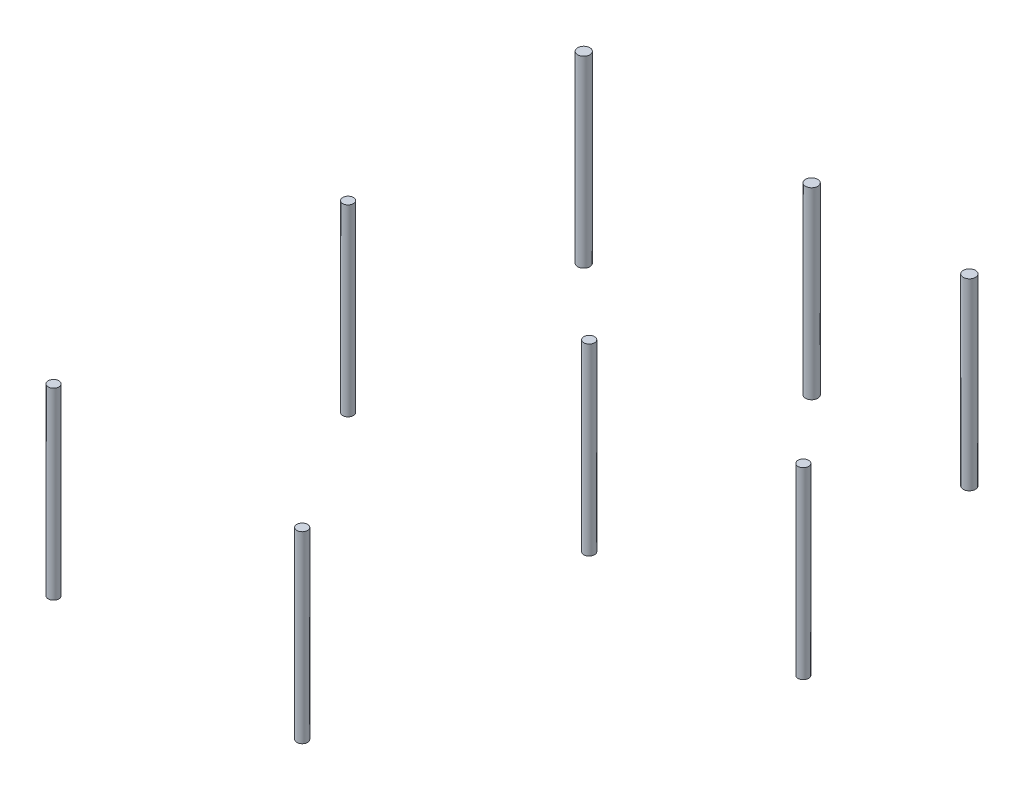
ISO-10303-21;
HEADER;
FILE_DESCRIPTION(('STEP AP214'),'2;1');
FILE_NAME('part.step','',(''),(''),'','','');
FILE_SCHEMA(('AUTOMOTIVE_DESIGN { 1 0 10303 214 1 1 1 1 }'));
ENDSEC;
DATA;
#1=APPLICATION_CONTEXT('core data for automotive mechanical design processes');
#2=APPLICATION_PROTOCOL_DEFINITION('international standard','automotive_design',2000,#1);
#3=PRODUCT_CONTEXT('',#1,'mechanical');
#4=PRODUCT('Part','Part','',(#3));
#5=PRODUCT_RELATED_PRODUCT_CATEGORY('part','',(#4));
#6=PRODUCT_DEFINITION_FORMATION('','',#4);
#7=PRODUCT_DEFINITION_CONTEXT('part definition',#1,'design');
#8=PRODUCT_DEFINITION('design','',#6,#7);
#9=PRODUCT_DEFINITION_SHAPE('','',#8);
#10=(LENGTH_UNIT() NAMED_UNIT(*) SI_UNIT(.MILLI.,.METRE.));
#11=(NAMED_UNIT(*) PLANE_ANGLE_UNIT() SI_UNIT($,.RADIAN.));
#12=(NAMED_UNIT(*) SI_UNIT($,.STERADIAN.) SOLID_ANGLE_UNIT());
#13=UNCERTAINTY_MEASURE_WITH_UNIT(LENGTH_MEASURE(1.E-05),#10,'distance_accuracy_value','');
#14=(GEOMETRIC_REPRESENTATION_CONTEXT(3) GLOBAL_UNCERTAINTY_ASSIGNED_CONTEXT((#13)) GLOBAL_UNIT_ASSIGNED_CONTEXT((#10,
#11,#12)) REPRESENTATION_CONTEXT('',''));
#15=CARTESIAN_POINT('',(0.,0.,0.));
#16=DIRECTION('',(0.,0.,1.));
#17=DIRECTION('',(1.,0.,0.));
#18=AXIS2_PLACEMENT_3D('',#15,#16,#17);
#19=CARTESIAN_POINT('',(325.,240.,0.));
#20=DIRECTION('',(0.,-1.,0.));
#21=DIRECTION('',(0.,0.,-1.));
#22=AXIS2_PLACEMENT_3D('',#19,#20,#21);
#23=CYLINDRICAL_SURFACE('',#22,6.99999999999999);
#24=CARTESIAN_POINT('',(325.,240.,0.));
#25=DIRECTION('',(0.,1.,0.));
#26=DIRECTION('',(0.,0.,1.));
#27=AXIS2_PLACEMENT_3D('',#24,#25,#26);
#28=CIRCLE('',#27,6.99999999999999);
#29=CARTESIAN_POINT('',(325.,240.,6.99999999999999));
#30=VERTEX_POINT('',#29);
#31=EDGE_CURVE('E11',#30,#30,#28,.T.);
#32=ORIENTED_EDGE('',*,*,#31,.F.);
#33=EDGE_LOOP('',(#32));
#34=FACE_BOUND('',#33,.T.);
#35=CARTESIAN_POINT('',(325.,0.,0.));
#36=DIRECTION('',(0.,1.,0.));
#37=DIRECTION('',(0.,0.,1.));
#38=AXIS2_PLACEMENT_3D('',#35,#36,#37);
#39=CIRCLE('',#38,6.99999999999999);
#40=CARTESIAN_POINT('',(325.,0.,6.99999999999999));
#41=VERTEX_POINT('',#40);
#42=EDGE_CURVE('E43',#41,#41,#39,.T.);
#43=ORIENTED_EDGE('',*,*,#42,.T.);
#44=EDGE_LOOP('',(#43));
#45=FACE_BOUND('',#44,.T.);
#46=ADVANCED_FACE('F40',(#34,#45),#23,.T.);
#47=CARTESIAN_POINT('',(325.,240.,0.));
#48=DIRECTION('',(0.,1.,0.));
#49=DIRECTION('',(0.,0.,1.));
#50=AXIS2_PLACEMENT_3D('',#47,#48,#49);
#51=PLANE('',#50);
#52=ORIENTED_EDGE('',*,*,#31,.T.);
#53=EDGE_LOOP('',(#52));
#54=FACE_BOUND('',#53,.T.);
#55=ADVANCED_FACE('F55',(#54),#51,.T.);
#56=CARTESIAN_POINT('',(325.,0.,0.));
#57=DIRECTION('',(0.,1.,0.));
#58=DIRECTION('',(0.,0.,1.));
#59=AXIS2_PLACEMENT_3D('',#56,#57,#58);
#60=PLANE('',#59);
#61=ORIENTED_EDGE('',*,*,#42,.F.);
#62=EDGE_LOOP('',(#61));
#63=FACE_BOUND('',#62,.T.);
#64=ADVANCED_FACE('F53',(#63),#60,.F.);
#65=CLOSED_SHELL('',(#46,#55,#64));
#66=MANIFOLD_SOLID_BREP('B2',#65);
#67=CARTESIAN_POINT('',(0.,240.,0.));
#68=DIRECTION('',(0.,-1.,0.));
#69=DIRECTION('',(0.,0.,-1.));
#70=AXIS2_PLACEMENT_3D('',#67,#68,#69);
#71=CYLINDRICAL_SURFACE('',#70,7.);
#72=CARTESIAN_POINT('',(0.,240.,0.));
#73=DIRECTION('',(0.,1.,0.));
#74=DIRECTION('',(0.,0.,1.));
#75=AXIS2_PLACEMENT_3D('',#72,#73,#74);
#76=CIRCLE('',#75,7.);
#77=CARTESIAN_POINT('',(0.,240.,7.));
#78=VERTEX_POINT('',#77);
#79=EDGE_CURVE('E39',#78,#78,#76,.T.);
#80=ORIENTED_EDGE('',*,*,#79,.F.);
#81=EDGE_LOOP('',(#80));
#82=FACE_BOUND('',#81,.T.);
#83=CARTESIAN_POINT('',(0.,0.,0.));
#84=DIRECTION('',(0.,1.,0.));
#85=DIRECTION('',(0.,0.,1.));
#86=AXIS2_PLACEMENT_3D('',#83,#84,#85);
#87=CIRCLE('',#86,7.);
#88=CARTESIAN_POINT('',(0.,0.,7.));
#89=VERTEX_POINT('',#88);
#90=EDGE_CURVE('E92',#89,#89,#87,.T.);
#91=ORIENTED_EDGE('',*,*,#90,.T.);
#92=EDGE_LOOP('',(#91));
#93=FACE_BOUND('',#92,.T.);
#94=ADVANCED_FACE('F89',(#82,#93),#71,.T.);
#95=CARTESIAN_POINT('',(0.,240.,0.));
#96=DIRECTION('',(0.,1.,0.));
#97=DIRECTION('',(0.,0.,1.));
#98=AXIS2_PLACEMENT_3D('',#95,#96,#97);
#99=PLANE('',#98);
#100=ORIENTED_EDGE('',*,*,#79,.T.);
#101=EDGE_LOOP('',(#100));
#102=FACE_BOUND('',#101,.T.);
#103=ADVANCED_FACE('F104',(#102),#99,.T.);
#104=CARTESIAN_POINT('',(0.,0.,0.));
#105=DIRECTION('',(0.,1.,0.));
#106=DIRECTION('',(0.,0.,1.));
#107=AXIS2_PLACEMENT_3D('',#104,#105,#106);
#108=PLANE('',#107);
#109=ORIENTED_EDGE('',*,*,#90,.F.);
#110=EDGE_LOOP('',(#109));
#111=FACE_BOUND('',#110,.T.);
#112=ADVANCED_FACE('F102',(#111),#108,.F.);
#113=CLOSED_SHELL('',(#94,#103,#112));
#114=MANIFOLD_SOLID_BREP('B6',#113);
#115=CARTESIAN_POINT('',(595.,255.,-385.));
#116=DIRECTION('',(0.,-1.,0.));
#117=DIRECTION('',(0.,0.,-1.));
#118=AXIS2_PLACEMENT_3D('',#115,#116,#117);
#119=CYLINDRICAL_SURFACE('',#118,7.00000000000004);
#120=CARTESIAN_POINT('',(595.,255.,-385.));
#121=DIRECTION('',(0.,1.,0.));
#122=DIRECTION('',(0.,0.,1.));
#123=AXIS2_PLACEMENT_3D('',#120,#121,#122);
#124=CIRCLE('',#123,7.00000000000004);
#125=CARTESIAN_POINT('',(595.,255.,-378.));
#126=VERTEX_POINT('',#125);
#127=EDGE_CURVE('E88',#126,#126,#124,.T.);
#128=ORIENTED_EDGE('',*,*,#127,.F.);
#129=EDGE_LOOP('',(#128));
#130=FACE_BOUND('',#129,.T.);
#131=CARTESIAN_POINT('',(595.,15.,-385.));
#132=DIRECTION('',(0.,1.,0.));
#133=DIRECTION('',(0.,0.,1.));
#134=AXIS2_PLACEMENT_3D('',#131,#132,#133);
#135=CIRCLE('',#134,7.00000000000004);
#136=CARTESIAN_POINT('',(595.,15.,-378.));
#137=VERTEX_POINT('',#136);
#138=EDGE_CURVE('E141',#137,#137,#135,.T.);
#139=ORIENTED_EDGE('',*,*,#138,.T.);
#140=EDGE_LOOP('',(#139));
#141=FACE_BOUND('',#140,.T.);
#142=ADVANCED_FACE('F138',(#130,#141),#119,.T.);
#143=CARTESIAN_POINT('',(595.,255.,-385.));
#144=DIRECTION('',(0.,1.,0.));
#145=DIRECTION('',(0.,0.,1.));
#146=AXIS2_PLACEMENT_3D('',#143,#144,#145);
#147=PLANE('',#146);
#148=ORIENTED_EDGE('',*,*,#127,.T.);
#149=EDGE_LOOP('',(#148));
#150=FACE_BOUND('',#149,.T.);
#151=ADVANCED_FACE('F153',(#150),#147,.T.);
#152=CARTESIAN_POINT('',(595.,15.,-385.));
#153=DIRECTION('',(0.,1.,0.));
#154=DIRECTION('',(0.,0.,1.));
#155=AXIS2_PLACEMENT_3D('',#152,#153,#154);
#156=PLANE('',#155);
#157=ORIENTED_EDGE('',*,*,#138,.F.);
#158=EDGE_LOOP('',(#157));
#159=FACE_BOUND('',#158,.T.);
#160=ADVANCED_FACE('F151',(#159),#156,.F.);
#161=CLOSED_SHELL('',(#142,#151,#160));
#162=MANIFOLD_SOLID_BREP('B34',#161);
#163=CARTESIAN_POINT('',(315.148251137762,255.,-385.));
#164=DIRECTION('',(0.,-1.,0.));
#165=DIRECTION('',(0.,0.,-1.));
#166=AXIS2_PLACEMENT_3D('',#163,#164,#165);
#167=CYLINDRICAL_SURFACE('',#166,6.99999999999999);
#168=CARTESIAN_POINT('',(315.148251137762,255.,-385.));
#169=DIRECTION('',(0.,1.,0.));
#170=DIRECTION('',(0.,0.,1.));
#171=AXIS2_PLACEMENT_3D('',#168,#169,#170);
#172=CIRCLE('',#171,6.99999999999999);
#173=CARTESIAN_POINT('',(315.148251137762,255.,-378.));
#174=VERTEX_POINT('',#173);
#175=EDGE_CURVE('E137',#174,#174,#172,.T.);
#176=ORIENTED_EDGE('',*,*,#175,.F.);
#177=EDGE_LOOP('',(#176));
#178=FACE_BOUND('',#177,.T.);
#179=CARTESIAN_POINT('',(315.148251137762,15.,-385.));
#180=DIRECTION('',(0.,1.,0.));
#181=DIRECTION('',(0.,0.,1.));
#182=AXIS2_PLACEMENT_3D('',#179,#180,#181);
#183=CIRCLE('',#182,6.99999999999999);
#184=CARTESIAN_POINT('',(315.148251137762,15.,-378.));
#185=VERTEX_POINT('',#184);
#186=EDGE_CURVE('E190',#185,#185,#183,.T.);
#187=ORIENTED_EDGE('',*,*,#186,.T.);
#188=EDGE_LOOP('',(#187));
#189=FACE_BOUND('',#188,.T.);
#190=ADVANCED_FACE('F187',(#178,#189),#167,.T.);
#191=CARTESIAN_POINT('',(315.148251137762,255.,-385.));
#192=DIRECTION('',(0.,1.,0.));
#193=DIRECTION('',(0.,0.,1.));
#194=AXIS2_PLACEMENT_3D('',#191,#192,#193);
#195=PLANE('',#194);
#196=ORIENTED_EDGE('',*,*,#175,.T.);
#197=EDGE_LOOP('',(#196));
#198=FACE_BOUND('',#197,.T.);
#199=ADVANCED_FACE('F202',(#198),#195,.T.);
#200=CARTESIAN_POINT('',(315.148251137762,15.,-385.));
#201=DIRECTION('',(0.,1.,0.));
#202=DIRECTION('',(0.,0.,1.));
#203=AXIS2_PLACEMENT_3D('',#200,#201,#202);
#204=PLANE('',#203);
#205=ORIENTED_EDGE('',*,*,#186,.F.);
#206=EDGE_LOOP('',(#205));
#207=FACE_BOUND('',#206,.T.);
#208=ADVANCED_FACE('F200',(#207),#204,.F.);
#209=CLOSED_SHELL('',(#190,#199,#208));
#210=MANIFOLD_SOLID_BREP('B83',#209);
#211=CARTESIAN_POINT('',(0.,255.,-385.));
#212=DIRECTION('',(0.,-1.,0.));
#213=DIRECTION('',(0.,0.,-1.));
#214=AXIS2_PLACEMENT_3D('',#211,#212,#213);
#215=CYLINDRICAL_SURFACE('',#214,7.);
#216=CARTESIAN_POINT('',(0.,255.,-385.));
#217=DIRECTION('',(0.,1.,0.));
#218=DIRECTION('',(0.,0.,1.));
#219=AXIS2_PLACEMENT_3D('',#216,#217,#218);
#220=CIRCLE('',#219,7.);
#221=CARTESIAN_POINT('',(0.,255.,-378.));
#222=VERTEX_POINT('',#221);
#223=EDGE_CURVE('E186',#222,#222,#220,.T.);
#224=ORIENTED_EDGE('',*,*,#223,.F.);
#225=EDGE_LOOP('',(#224));
#226=FACE_BOUND('',#225,.T.);
#227=CARTESIAN_POINT('',(0.,15.,-385.));
#228=DIRECTION('',(0.,1.,0.));
#229=DIRECTION('',(0.,0.,1.));
#230=AXIS2_PLACEMENT_3D('',#227,#228,#229);
#231=CIRCLE('',#230,7.);
#232=CARTESIAN_POINT('',(0.,15.,-378.));
#233=VERTEX_POINT('',#232);
#234=EDGE_CURVE('E239',#233,#233,#231,.T.);
#235=ORIENTED_EDGE('',*,*,#234,.T.);
#236=EDGE_LOOP('',(#235));
#237=FACE_BOUND('',#236,.T.);
#238=ADVANCED_FACE('F236',(#226,#237),#215,.T.);
#239=CARTESIAN_POINT('',(0.,255.,-385.));
#240=DIRECTION('',(0.,1.,0.));
#241=DIRECTION('',(0.,0.,1.));
#242=AXIS2_PLACEMENT_3D('',#239,#240,#241);
#243=PLANE('',#242);
#244=ORIENTED_EDGE('',*,*,#223,.T.);
#245=EDGE_LOOP('',(#244));
#246=FACE_BOUND('',#245,.T.);
#247=ADVANCED_FACE('F251',(#246),#243,.T.);
#248=CARTESIAN_POINT('',(0.,15.,-385.));
#249=DIRECTION('',(0.,1.,0.));
#250=DIRECTION('',(0.,0.,1.));
#251=AXIS2_PLACEMENT_3D('',#248,#249,#250);
#252=PLANE('',#251);
#253=ORIENTED_EDGE('',*,*,#234,.F.);
#254=EDGE_LOOP('',(#253));
#255=FACE_BOUND('',#254,.T.);
#256=ADVANCED_FACE('F249',(#255),#252,.F.);
#257=CLOSED_SHELL('',(#238,#247,#256));
#258=MANIFOLD_SOLID_BREP('B132',#257);
#259=CARTESIAN_POINT('',(504.,270.,-693.016670882735));
#260=DIRECTION('',(0.,-1.,0.));
#261=DIRECTION('',(0.,0.,-1.));
#262=AXIS2_PLACEMENT_3D('',#259,#260,#261);
#263=CYLINDRICAL_SURFACE('',#262,7.99999999999999);
#264=CARTESIAN_POINT('',(504.,270.,-693.016670882735));
#265=DIRECTION('',(0.,1.,0.));
#266=DIRECTION('',(0.,0.,1.));
#267=AXIS2_PLACEMENT_3D('',#264,#265,#266);
#268=CIRCLE('',#267,7.99999999999999);
#269=CARTESIAN_POINT('',(504.,270.,-685.016670882735));
#270=VERTEX_POINT('',#269);
#271=EDGE_CURVE('E235',#270,#270,#268,.T.);
#272=ORIENTED_EDGE('',*,*,#271,.F.);
#273=EDGE_LOOP('',(#272));
#274=FACE_BOUND('',#273,.T.);
#275=CARTESIAN_POINT('',(504.,30.,-693.016670882735));
#276=DIRECTION('',(0.,1.,0.));
#277=DIRECTION('',(0.,0.,1.));
#278=AXIS2_PLACEMENT_3D('',#275,#276,#277);
#279=CIRCLE('',#278,7.99999999999999);
#280=CARTESIAN_POINT('',(504.,30.,-685.016670882735));
#281=VERTEX_POINT('',#280);
#282=EDGE_CURVE('E288',#281,#281,#279,.T.);
#283=ORIENTED_EDGE('',*,*,#282,.T.);
#284=EDGE_LOOP('',(#283));
#285=FACE_BOUND('',#284,.T.);
#286=ADVANCED_FACE('F285',(#274,#285),#263,.T.);
#287=CARTESIAN_POINT('',(504.,270.,-693.016670882735));
#288=DIRECTION('',(0.,1.,0.));
#289=DIRECTION('',(0.,0.,1.));
#290=AXIS2_PLACEMENT_3D('',#287,#288,#289);
#291=PLANE('',#290);
#292=ORIENTED_EDGE('',*,*,#271,.T.);
#293=EDGE_LOOP('',(#292));
#294=FACE_BOUND('',#293,.T.);
#295=ADVANCED_FACE('F300',(#294),#291,.T.);
#296=CARTESIAN_POINT('',(504.,30.,-693.016670882735));
#297=DIRECTION('',(0.,1.,0.));
#298=DIRECTION('',(0.,0.,1.));
#299=AXIS2_PLACEMENT_3D('',#296,#297,#298);
#300=PLANE('',#299);
#301=ORIENTED_EDGE('',*,*,#282,.F.);
#302=EDGE_LOOP('',(#301));
#303=FACE_BOUND('',#302,.T.);
#304=ADVANCED_FACE('F298',(#303),#300,.F.);
#305=CLOSED_SHELL('',(#286,#295,#304));
#306=MANIFOLD_SOLID_BREP('B181',#305);
#307=CARTESIAN_POINT('',(297.870449081854,270.,-693.016670882735));
#308=DIRECTION('',(0.,-1.,0.));
#309=DIRECTION('',(0.,0.,-1.));
#310=AXIS2_PLACEMENT_3D('',#307,#308,#309);
#311=CYLINDRICAL_SURFACE('',#310,7.99999999999999);
#312=CARTESIAN_POINT('',(297.870449081854,270.,-693.016670882735));
#313=DIRECTION('',(0.,1.,0.));
#314=DIRECTION('',(0.,0.,1.));
#315=AXIS2_PLACEMENT_3D('',#312,#313,#314);
#316=CIRCLE('',#315,7.99999999999999);
#317=CARTESIAN_POINT('',(297.870449081854,270.,-685.016670882735));
#318=VERTEX_POINT('',#317);
#319=EDGE_CURVE('E284',#318,#318,#316,.T.);
#320=ORIENTED_EDGE('',*,*,#319,.F.);
#321=EDGE_LOOP('',(#320));
#322=FACE_BOUND('',#321,.T.);
#323=CARTESIAN_POINT('',(297.870449081854,30.,-693.016670882735));
#324=DIRECTION('',(0.,1.,0.));
#325=DIRECTION('',(0.,0.,1.));
#326=AXIS2_PLACEMENT_3D('',#323,#324,#325);
#327=CIRCLE('',#326,7.99999999999999);
#328=CARTESIAN_POINT('',(297.870449081854,30.,-685.016670882735));
#329=VERTEX_POINT('',#328);
#330=EDGE_CURVE('E336',#329,#329,#327,.T.);
#331=ORIENTED_EDGE('',*,*,#330,.T.);
#332=EDGE_LOOP('',(#331));
#333=FACE_BOUND('',#332,.T.);
#334=ADVANCED_FACE('F333',(#322,#333),#311,.T.);
#335=CARTESIAN_POINT('',(297.870449081854,270.,-693.016670882735));
#336=DIRECTION('',(0.,1.,0.));
#337=DIRECTION('',(0.,0.,1.));
#338=AXIS2_PLACEMENT_3D('',#335,#336,#337);
#339=PLANE('',#338);
#340=ORIENTED_EDGE('',*,*,#319,.T.);
#341=EDGE_LOOP('',(#340));
#342=FACE_BOUND('',#341,.T.);
#343=ADVANCED_FACE('F348',(#342),#339,.T.);
#344=CARTESIAN_POINT('',(297.870449081854,30.,-693.016670882735));
#345=DIRECTION('',(0.,1.,0.));
#346=DIRECTION('',(0.,0.,1.));
#347=AXIS2_PLACEMENT_3D('',#344,#345,#346);
#348=PLANE('',#347);
#349=ORIENTED_EDGE('',*,*,#330,.F.);
#350=EDGE_LOOP('',(#349));
#351=FACE_BOUND('',#350,.T.);
#352=ADVANCED_FACE('F346',(#351),#348,.F.);
#353=CLOSED_SHELL('',(#334,#343,#352));
#354=MANIFOLD_SOLID_BREP('B230',#353);
#355=CARTESIAN_POINT('',(0.,270.,-693.016670882735));
#356=DIRECTION('',(0.,-1.,0.));
#357=DIRECTION('',(0.,0.,-1.));
#358=AXIS2_PLACEMENT_3D('',#355,#356,#357);
#359=CYLINDRICAL_SURFACE('',#358,7.99999999999999);
#360=CARTESIAN_POINT('',(0.,270.,-693.016670882735));
#361=DIRECTION('',(0.,1.,0.));
#362=DIRECTION('',(0.,0.,1.));
#363=AXIS2_PLACEMENT_3D('',#360,#361,#362);
#364=CIRCLE('',#363,7.99999999999999);
#365=CARTESIAN_POINT('',(0.,270.,-685.016670882735));
#366=VERTEX_POINT('',#365);
#367=EDGE_CURVE('E332',#366,#366,#364,.T.);
#368=ORIENTED_EDGE('',*,*,#367,.F.);
#369=EDGE_LOOP('',(#368));
#370=FACE_BOUND('',#369,.T.);
#371=CARTESIAN_POINT('',(0.,30.,-693.016670882735));
#372=DIRECTION('',(0.,1.,0.));
#373=DIRECTION('',(0.,0.,1.));
#374=AXIS2_PLACEMENT_3D('',#371,#372,#373);
#375=CIRCLE('',#374,7.99999999999999);
#376=CARTESIAN_POINT('',(0.,30.,-685.016670882735));
#377=VERTEX_POINT('',#376);
#378=EDGE_CURVE('E377',#377,#377,#375,.T.);
#379=ORIENTED_EDGE('',*,*,#378,.T.);
#380=EDGE_LOOP('',(#379));
#381=FACE_BOUND('',#380,.T.);
#382=ADVANCED_FACE('F374',(#370,#381),#359,.T.);
#383=CARTESIAN_POINT('',(0.,270.,-693.016670882735));
#384=DIRECTION('',(0.,1.,0.));
#385=DIRECTION('',(0.,0.,1.));
#386=AXIS2_PLACEMENT_3D('',#383,#384,#385);
#387=PLANE('',#386);
#388=ORIENTED_EDGE('',*,*,#367,.T.);
#389=EDGE_LOOP('',(#388));
#390=FACE_BOUND('',#389,.T.);
#391=ADVANCED_FACE('F389',(#390),#387,.T.);
#392=CARTESIAN_POINT('',(0.,30.,-693.016670882735));
#393=DIRECTION('',(0.,1.,0.));
#394=DIRECTION('',(0.,0.,1.));
#395=AXIS2_PLACEMENT_3D('',#392,#393,#394);
#396=PLANE('',#395);
#397=ORIENTED_EDGE('',*,*,#378,.F.);
#398=EDGE_LOOP('',(#397));
#399=FACE_BOUND('',#398,.T.);
#400=ADVANCED_FACE('F387',(#399),#396,.F.);
#401=CLOSED_SHELL('',(#382,#391,#400));
#402=MANIFOLD_SOLID_BREP('B279',#401);
#403=ADVANCED_BREP_SHAPE_REPRESENTATION('',(#18,#66,#114,#162,#210,#258,#306,#354,#402),#14);
#404=SHAPE_DEFINITION_REPRESENTATION(#9,#403);
ENDSEC;
END-ISO-10303-21;
